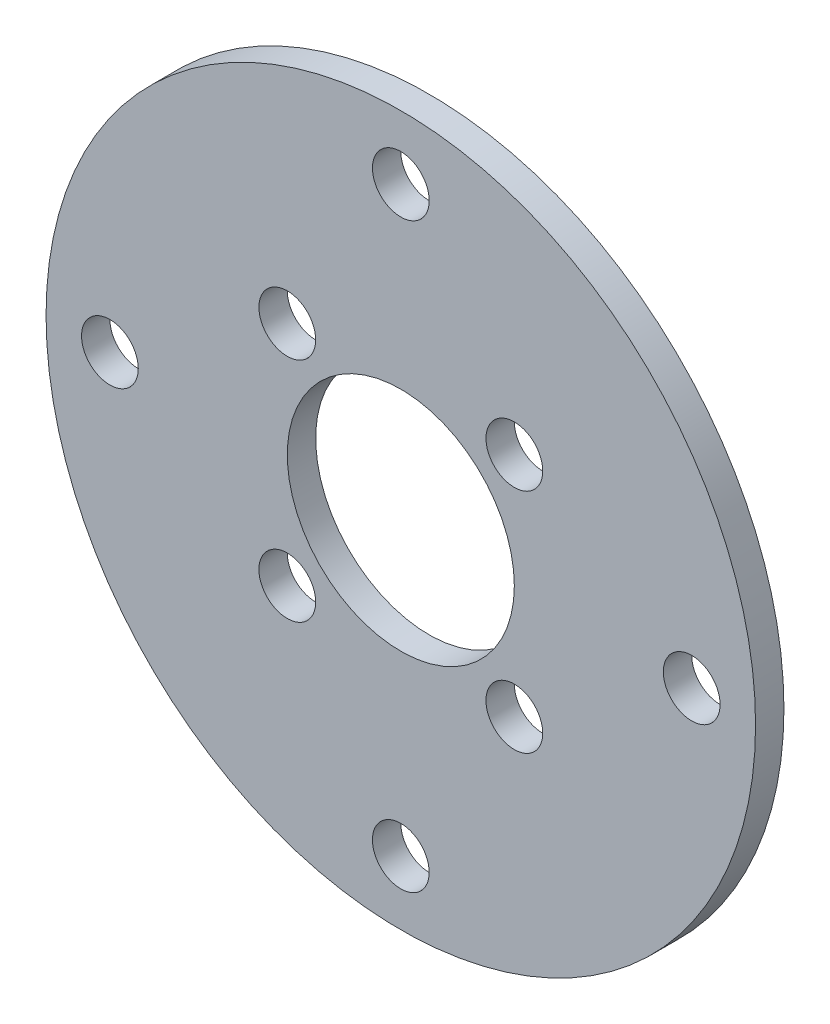
ISO-10303-21;
HEADER;
FILE_DESCRIPTION(('STEP AP214'),'2;1');
FILE_NAME('part.step','',(''),(''),'','','');
FILE_SCHEMA(('AUTOMOTIVE_DESIGN { 1 0 10303 214 1 1 1 1 }'));
ENDSEC;
DATA;
#1=APPLICATION_CONTEXT('core data for automotive mechanical design processes');
#2=APPLICATION_PROTOCOL_DEFINITION('international standard','automotive_design',2000,#1);
#3=PRODUCT_CONTEXT('',#1,'mechanical');
#4=PRODUCT('Part','Part','',(#3));
#5=PRODUCT_RELATED_PRODUCT_CATEGORY('part','',(#4));
#6=PRODUCT_DEFINITION_FORMATION('','',#4);
#7=PRODUCT_DEFINITION_CONTEXT('part definition',#1,'design');
#8=PRODUCT_DEFINITION('design','',#6,#7);
#9=PRODUCT_DEFINITION_SHAPE('','',#8);
#10=(LENGTH_UNIT() NAMED_UNIT(*) SI_UNIT(.MILLI.,.METRE.));
#11=(NAMED_UNIT(*) PLANE_ANGLE_UNIT() SI_UNIT($,.RADIAN.));
#12=(NAMED_UNIT(*) SI_UNIT($,.STERADIAN.) SOLID_ANGLE_UNIT());
#13=UNCERTAINTY_MEASURE_WITH_UNIT(LENGTH_MEASURE(1.E-05),#10,'distance_accuracy_value','');
#14=(GEOMETRIC_REPRESENTATION_CONTEXT(3) GLOBAL_UNCERTAINTY_ASSIGNED_CONTEXT((#13)) GLOBAL_UNIT_ASSIGNED_CONTEXT((#10,
#11,#12)) REPRESENTATION_CONTEXT('',''));
#15=CARTESIAN_POINT('',(0.,0.,0.));
#16=DIRECTION('',(0.,0.,1.));
#17=DIRECTION('',(1.,0.,0.));
#18=AXIS2_PLACEMENT_3D('',#15,#16,#17);
#19=CARTESIAN_POINT('',(0.,0.,2.));
#20=DIRECTION('',(0.,0.,1.));
#21=DIRECTION('',(1.,0.,0.));
#22=AXIS2_PLACEMENT_3D('',#19,#20,#21);
#23=PLANE('',#22);
#24=CARTESIAN_POINT('',(1.15775850883181E-12,-20.5,2.));
#25=DIRECTION('',(0.,0.,1.));
#26=DIRECTION('',(1.,0.,0.));
#27=AXIS2_PLACEMENT_3D('',#24,#25,#26);
#28=CIRCLE('',#27,2.00000000000124);
#29=CARTESIAN_POINT('',(2.0000000000024,-20.5,2.));
#30=VERTEX_POINT('',#29);
#31=EDGE_CURVE('E85',#30,#30,#28,.T.);
#32=ORIENTED_EDGE('',*,*,#31,.F.);
#33=EDGE_LOOP('',(#32));
#34=FACE_BOUND('',#33,.T.);
#35=CARTESIAN_POINT('',(0.,20.5,2.));
#36=DIRECTION('',(0.,0.,1.));
#37=DIRECTION('',(1.,0.,0.));
#38=AXIS2_PLACEMENT_3D('',#35,#36,#37);
#39=CIRCLE('',#38,2.);
#40=CARTESIAN_POINT('',(2.,20.5,2.));
#41=VERTEX_POINT('',#40);
#42=EDGE_CURVE('E73',#41,#41,#39,.T.);
#43=ORIENTED_EDGE('',*,*,#42,.F.);
#44=EDGE_LOOP('',(#43));
#45=FACE_BOUND('',#44,.T.);
#46=CARTESIAN_POINT('',(8.,-8.,2.));
#47=DIRECTION('',(0.,0.,1.));
#48=DIRECTION('',(-1.,0.,0.));
#49=AXIS2_PLACEMENT_3D('',#46,#47,#48);
#50=CIRCLE('',#49,2.);
#51=CARTESIAN_POINT('',(6.,-8.,2.));
#52=VERTEX_POINT('',#51);
#53=EDGE_CURVE('E61',#52,#52,#50,.T.);
#54=ORIENTED_EDGE('',*,*,#53,.F.);
#55=EDGE_LOOP('',(#54));
#56=FACE_BOUND('',#55,.T.);
#57=CARTESIAN_POINT('',(-8.,8.,2.));
#58=DIRECTION('',(0.,0.,1.));
#59=DIRECTION('',(1.,0.,0.));
#60=AXIS2_PLACEMENT_3D('',#57,#58,#59);
#61=CIRCLE('',#60,2.);
#62=CARTESIAN_POINT('',(-6.,8.,2.));
#63=VERTEX_POINT('',#62);
#64=EDGE_CURVE('E49',#63,#63,#61,.T.);
#65=ORIENTED_EDGE('',*,*,#64,.F.);
#66=EDGE_LOOP('',(#65));
#67=FACE_BOUND('',#66,.T.);
#68=CARTESIAN_POINT('',(0.,0.,2.));
#69=DIRECTION('',(0.,0.,1.));
#70=DIRECTION('',(1.,0.,0.));
#71=AXIS2_PLACEMENT_3D('',#68,#69,#70);
#72=CIRCLE('',#71,25.);
#73=CARTESIAN_POINT('',(25.,0.,2.));
#74=VERTEX_POINT('',#73);
#75=EDGE_CURVE('E10',#74,#74,#72,.T.);
#76=ORIENTED_EDGE('',*,*,#75,.T.);
#77=EDGE_LOOP('',(#76));
#78=FACE_BOUND('',#77,.T.);
#79=CARTESIAN_POINT('',(0.,0.,2.));
#80=DIRECTION('',(0.,0.,1.));
#81=DIRECTION('',(1.,0.,0.));
#82=AXIS2_PLACEMENT_3D('',#79,#80,#81);
#83=CIRCLE('',#82,8.);
#84=CARTESIAN_POINT('',(8.,0.,2.));
#85=VERTEX_POINT('',#84);
#86=EDGE_CURVE('E44',#85,#85,#83,.T.);
#87=ORIENTED_EDGE('',*,*,#86,.F.);
#88=EDGE_LOOP('',(#87));
#89=FACE_BOUND('',#88,.T.);
#90=CARTESIAN_POINT('',(8.,8.,2.));
#91=DIRECTION('',(0.,0.,1.));
#92=DIRECTION('',(1.,0.,0.));
#93=AXIS2_PLACEMENT_3D('',#90,#91,#92);
#94=CIRCLE('',#93,2.);
#95=CARTESIAN_POINT('',(10.,8.,2.));
#96=VERTEX_POINT('',#95);
#97=EDGE_CURVE('E55',#96,#96,#94,.T.);
#98=ORIENTED_EDGE('',*,*,#97,.F.);
#99=EDGE_LOOP('',(#98));
#100=FACE_BOUND('',#99,.T.);
#101=CARTESIAN_POINT('',(-8.,-8.,2.));
#102=DIRECTION('',(0.,0.,1.));
#103=DIRECTION('',(-1.,0.,0.));
#104=AXIS2_PLACEMENT_3D('',#101,#102,#103);
#105=CIRCLE('',#104,2.);
#106=CARTESIAN_POINT('',(-10.,-8.,2.));
#107=VERTEX_POINT('',#106);
#108=EDGE_CURVE('E67',#107,#107,#105,.T.);
#109=ORIENTED_EDGE('',*,*,#108,.F.);
#110=EDGE_LOOP('',(#109));
#111=FACE_BOUND('',#110,.T.);
#112=CARTESIAN_POINT('',(20.5000000000006,5.78879254415904E-13,2.));
#113=DIRECTION('',(0.,0.,1.));
#114=DIRECTION('',(1.,0.,0.));
#115=AXIS2_PLACEMENT_3D('',#112,#113,#114);
#116=CIRCLE('',#115,2.00000000000045);
#117=CARTESIAN_POINT('',(22.500000000001,5.78879254415904E-13,2.));
#118=VERTEX_POINT('',#117);
#119=EDGE_CURVE('E79',#118,#118,#116,.T.);
#120=ORIENTED_EDGE('',*,*,#119,.F.);
#121=EDGE_LOOP('',(#120));
#122=FACE_BOUND('',#121,.T.);
#123=CARTESIAN_POINT('',(-20.4999999999994,-5.81389780354156E-13,2.));
#124=DIRECTION('',(0.,0.,1.));
#125=DIRECTION('',(1.,0.,0.));
#126=AXIS2_PLACEMENT_3D('',#123,#124,#125);
#127=CIRCLE('',#126,2.00000000000093);
#128=CARTESIAN_POINT('',(-18.4999999999985,-5.81389780354156E-13,2.));
#129=VERTEX_POINT('',#128);
#130=EDGE_CURVE('E91',#129,#129,#127,.T.);
#131=ORIENTED_EDGE('',*,*,#130,.F.);
#132=EDGE_LOOP('',(#131));
#133=FACE_BOUND('',#132,.T.);
#134=ADVANCED_FACE('F33',(#34,#45,#56,#67,#78,#89,#100,#111,#122,#133),#23,.T.);
#135=CARTESIAN_POINT('',(0.,0.,0.));
#136=DIRECTION('',(0.,0.,1.));
#137=DIRECTION('',(1.,0.,0.));
#138=AXIS2_PLACEMENT_3D('',#135,#136,#137);
#139=PLANE('',#138);
#140=CARTESIAN_POINT('',(0.,0.,0.));
#141=DIRECTION('',(0.,0.,1.));
#142=DIRECTION('',(1.,0.,0.));
#143=AXIS2_PLACEMENT_3D('',#140,#141,#142);
#144=CIRCLE('',#143,25.);
#145=CARTESIAN_POINT('',(25.,0.,0.));
#146=VERTEX_POINT('',#145);
#147=EDGE_CURVE('E37',#146,#146,#144,.T.);
#148=ORIENTED_EDGE('',*,*,#147,.F.);
#149=EDGE_LOOP('',(#148));
#150=FACE_BOUND('',#149,.T.);
#151=CARTESIAN_POINT('',(0.,0.,0.));
#152=DIRECTION('',(0.,0.,1.));
#153=DIRECTION('',(1.,0.,0.));
#154=AXIS2_PLACEMENT_3D('',#151,#152,#153);
#155=CIRCLE('',#154,8.);
#156=CARTESIAN_POINT('',(8.,0.,0.));
#157=VERTEX_POINT('',#156);
#158=EDGE_CURVE('E46',#157,#157,#155,.T.);
#159=ORIENTED_EDGE('',*,*,#158,.T.);
#160=EDGE_LOOP('',(#159));
#161=FACE_BOUND('',#160,.T.);
#162=CARTESIAN_POINT('',(-8.,8.,0.));
#163=DIRECTION('',(0.,0.,1.));
#164=DIRECTION('',(1.,0.,0.));
#165=AXIS2_PLACEMENT_3D('',#162,#163,#164);
#166=CIRCLE('',#165,2.);
#167=CARTESIAN_POINT('',(-6.,8.,0.));
#168=VERTEX_POINT('',#167);
#169=EDGE_CURVE('E52',#168,#168,#166,.T.);
#170=ORIENTED_EDGE('',*,*,#169,.T.);
#171=EDGE_LOOP('',(#170));
#172=FACE_BOUND('',#171,.T.);
#173=CARTESIAN_POINT('',(8.,8.,0.));
#174=DIRECTION('',(0.,0.,1.));
#175=DIRECTION('',(1.,0.,0.));
#176=AXIS2_PLACEMENT_3D('',#173,#174,#175);
#177=CIRCLE('',#176,2.);
#178=CARTESIAN_POINT('',(10.,8.,0.));
#179=VERTEX_POINT('',#178);
#180=EDGE_CURVE('E58',#179,#179,#177,.T.);
#181=ORIENTED_EDGE('',*,*,#180,.T.);
#182=EDGE_LOOP('',(#181));
#183=FACE_BOUND('',#182,.T.);
#184=CARTESIAN_POINT('',(8.,-8.,0.));
#185=DIRECTION('',(0.,0.,1.));
#186=DIRECTION('',(-1.,0.,0.));
#187=AXIS2_PLACEMENT_3D('',#184,#185,#186);
#188=CIRCLE('',#187,2.);
#189=CARTESIAN_POINT('',(6.,-8.,0.));
#190=VERTEX_POINT('',#189);
#191=EDGE_CURVE('E64',#190,#190,#188,.T.);
#192=ORIENTED_EDGE('',*,*,#191,.T.);
#193=EDGE_LOOP('',(#192));
#194=FACE_BOUND('',#193,.T.);
#195=CARTESIAN_POINT('',(-8.,-8.,0.));
#196=DIRECTION('',(0.,0.,1.));
#197=DIRECTION('',(-1.,0.,0.));
#198=AXIS2_PLACEMENT_3D('',#195,#196,#197);
#199=CIRCLE('',#198,2.);
#200=CARTESIAN_POINT('',(-10.,-8.,0.));
#201=VERTEX_POINT('',#200);
#202=EDGE_CURVE('E70',#201,#201,#199,.T.);
#203=ORIENTED_EDGE('',*,*,#202,.T.);
#204=EDGE_LOOP('',(#203));
#205=FACE_BOUND('',#204,.T.);
#206=CARTESIAN_POINT('',(0.,20.5,0.));
#207=DIRECTION('',(0.,0.,1.));
#208=DIRECTION('',(1.,0.,0.));
#209=AXIS2_PLACEMENT_3D('',#206,#207,#208);
#210=CIRCLE('',#209,2.);
#211=CARTESIAN_POINT('',(2.,20.5,0.));
#212=VERTEX_POINT('',#211);
#213=EDGE_CURVE('E76',#212,#212,#210,.T.);
#214=ORIENTED_EDGE('',*,*,#213,.T.);
#215=EDGE_LOOP('',(#214));
#216=FACE_BOUND('',#215,.T.);
#217=CARTESIAN_POINT('',(20.5000000000006,5.78879254415904E-13,0.));
#218=DIRECTION('',(0.,0.,1.));
#219=DIRECTION('',(1.,0.,0.));
#220=AXIS2_PLACEMENT_3D('',#217,#218,#219);
#221=CIRCLE('',#220,2.00000000000045);
#222=CARTESIAN_POINT('',(22.500000000001,5.78879254415904E-13,0.));
#223=VERTEX_POINT('',#222);
#224=EDGE_CURVE('E82',#223,#223,#221,.T.);
#225=ORIENTED_EDGE('',*,*,#224,.T.);
#226=EDGE_LOOP('',(#225));
#227=FACE_BOUND('',#226,.T.);
#228=CARTESIAN_POINT('',(1.15775850883181E-12,-20.5,0.));
#229=DIRECTION('',(0.,0.,1.));
#230=DIRECTION('',(1.,0.,0.));
#231=AXIS2_PLACEMENT_3D('',#228,#229,#230);
#232=CIRCLE('',#231,2.00000000000124);
#233=CARTESIAN_POINT('',(2.0000000000024,-20.5,0.));
#234=VERTEX_POINT('',#233);
#235=EDGE_CURVE('E88',#234,#234,#232,.T.);
#236=ORIENTED_EDGE('',*,*,#235,.T.);
#237=EDGE_LOOP('',(#236));
#238=FACE_BOUND('',#237,.T.);
#239=CARTESIAN_POINT('',(-20.4999999999994,-5.81389780354156E-13,0.));
#240=DIRECTION('',(0.,0.,1.));
#241=DIRECTION('',(1.,0.,0.));
#242=AXIS2_PLACEMENT_3D('',#239,#240,#241);
#243=CIRCLE('',#242,2.00000000000093);
#244=CARTESIAN_POINT('',(-18.4999999999985,-5.81389780354156E-13,0.));
#245=VERTEX_POINT('',#244);
#246=EDGE_CURVE('E94',#245,#245,#243,.T.);
#247=ORIENTED_EDGE('',*,*,#246,.T.);
#248=EDGE_LOOP('',(#247));
#249=FACE_BOUND('',#248,.T.);
#250=ADVANCED_FACE('F104',(#150,#161,#172,#183,#194,#205,#216,#227,#238,#249),#139,.F.);
#251=CARTESIAN_POINT('',(0.,0.,2.));
#252=DIRECTION('',(0.,0.,-1.));
#253=DIRECTION('',(-1.,0.,0.));
#254=AXIS2_PLACEMENT_3D('',#251,#252,#253);
#255=CYLINDRICAL_SURFACE('',#254,25.);
#256=ORIENTED_EDGE('',*,*,#75,.F.);
#257=EDGE_LOOP('',(#256));
#258=FACE_BOUND('',#257,.T.);
#259=ORIENTED_EDGE('',*,*,#147,.T.);
#260=EDGE_LOOP('',(#259));
#261=FACE_BOUND('',#260,.T.);
#262=ADVANCED_FACE('F35',(#258,#261),#255,.T.);
#263=CARTESIAN_POINT('',(0.,0.,2.));
#264=DIRECTION('',(0.,0.,-1.));
#265=DIRECTION('',(-1.,0.,0.));
#266=AXIS2_PLACEMENT_3D('',#263,#264,#265);
#267=CYLINDRICAL_SURFACE('',#266,8.);
#268=ORIENTED_EDGE('',*,*,#86,.T.);
#269=EDGE_LOOP('',(#268));
#270=FACE_BOUND('',#269,.T.);
#271=ORIENTED_EDGE('',*,*,#158,.F.);
#272=EDGE_LOOP('',(#271));
#273=FACE_BOUND('',#272,.T.);
#274=ADVANCED_FACE('F114',(#270,#273),#267,.F.);
#275=CARTESIAN_POINT('',(-8.,8.,2.));
#276=DIRECTION('',(0.,0.,-1.));
#277=DIRECTION('',(-1.,0.,0.));
#278=AXIS2_PLACEMENT_3D('',#275,#276,#277);
#279=CYLINDRICAL_SURFACE('',#278,2.);
#280=ORIENTED_EDGE('',*,*,#64,.T.);
#281=EDGE_LOOP('',(#280));
#282=FACE_BOUND('',#281,.T.);
#283=ORIENTED_EDGE('',*,*,#169,.F.);
#284=EDGE_LOOP('',(#283));
#285=FACE_BOUND('',#284,.T.);
#286=ADVANCED_FACE('F117',(#282,#285),#279,.F.);
#287=CARTESIAN_POINT('',(8.,8.,2.));
#288=DIRECTION('',(0.,0.,-1.));
#289=DIRECTION('',(-1.,0.,0.));
#290=AXIS2_PLACEMENT_3D('',#287,#288,#289);
#291=CYLINDRICAL_SURFACE('',#290,2.);
#292=ORIENTED_EDGE('',*,*,#97,.T.);
#293=EDGE_LOOP('',(#292));
#294=FACE_BOUND('',#293,.T.);
#295=ORIENTED_EDGE('',*,*,#180,.F.);
#296=EDGE_LOOP('',(#295));
#297=FACE_BOUND('',#296,.T.);
#298=ADVANCED_FACE('F121',(#294,#297),#291,.F.);
#299=CARTESIAN_POINT('',(8.,-8.,2.));
#300=DIRECTION('',(0.,0.,-1.));
#301=DIRECTION('',(-1.,0.,0.));
#302=AXIS2_PLACEMENT_3D('',#299,#300,#301);
#303=CYLINDRICAL_SURFACE('',#302,2.);
#304=ORIENTED_EDGE('',*,*,#53,.T.);
#305=EDGE_LOOP('',(#304));
#306=FACE_BOUND('',#305,.T.);
#307=ORIENTED_EDGE('',*,*,#191,.F.);
#308=EDGE_LOOP('',(#307));
#309=FACE_BOUND('',#308,.T.);
#310=ADVANCED_FACE('F125',(#306,#309),#303,.F.);
#311=CARTESIAN_POINT('',(-8.,-8.,2.));
#312=DIRECTION('',(0.,0.,-1.));
#313=DIRECTION('',(-1.,0.,0.));
#314=AXIS2_PLACEMENT_3D('',#311,#312,#313);
#315=CYLINDRICAL_SURFACE('',#314,2.);
#316=ORIENTED_EDGE('',*,*,#108,.T.);
#317=EDGE_LOOP('',(#316));
#318=FACE_BOUND('',#317,.T.);
#319=ORIENTED_EDGE('',*,*,#202,.F.);
#320=EDGE_LOOP('',(#319));
#321=FACE_BOUND('',#320,.T.);
#322=ADVANCED_FACE('F129',(#318,#321),#315,.F.);
#323=CARTESIAN_POINT('',(0.,20.5,2.));
#324=DIRECTION('',(0.,0.,-1.));
#325=DIRECTION('',(-1.,0.,0.));
#326=AXIS2_PLACEMENT_3D('',#323,#324,#325);
#327=CYLINDRICAL_SURFACE('',#326,2.);
#328=ORIENTED_EDGE('',*,*,#42,.T.);
#329=EDGE_LOOP('',(#328));
#330=FACE_BOUND('',#329,.T.);
#331=ORIENTED_EDGE('',*,*,#213,.F.);
#332=EDGE_LOOP('',(#331));
#333=FACE_BOUND('',#332,.T.);
#334=ADVANCED_FACE('F133',(#330,#333),#327,.F.);
#335=CARTESIAN_POINT('',(20.5000000000006,5.78879254415904E-13,2.));
#336=DIRECTION('',(0.,0.,-1.));
#337=DIRECTION('',(-1.,0.,0.));
#338=AXIS2_PLACEMENT_3D('',#335,#336,#337);
#339=CYLINDRICAL_SURFACE('',#338,2.00000000000045);
#340=ORIENTED_EDGE('',*,*,#119,.T.);
#341=EDGE_LOOP('',(#340));
#342=FACE_BOUND('',#341,.T.);
#343=ORIENTED_EDGE('',*,*,#224,.F.);
#344=EDGE_LOOP('',(#343));
#345=FACE_BOUND('',#344,.T.);
#346=ADVANCED_FACE('F137',(#342,#345),#339,.F.);
#347=CARTESIAN_POINT('',(1.15775850883181E-12,-20.5,2.));
#348=DIRECTION('',(0.,0.,-1.));
#349=DIRECTION('',(-1.,0.,0.));
#350=AXIS2_PLACEMENT_3D('',#347,#348,#349);
#351=CYLINDRICAL_SURFACE('',#350,2.00000000000124);
#352=ORIENTED_EDGE('',*,*,#31,.T.);
#353=EDGE_LOOP('',(#352));
#354=FACE_BOUND('',#353,.T.);
#355=ORIENTED_EDGE('',*,*,#235,.F.);
#356=EDGE_LOOP('',(#355));
#357=FACE_BOUND('',#356,.T.);
#358=ADVANCED_FACE('F141',(#354,#357),#351,.F.);
#359=CARTESIAN_POINT('',(-20.4999999999994,-5.81389780354156E-13,2.));
#360=DIRECTION('',(0.,0.,-1.));
#361=DIRECTION('',(-1.,0.,0.));
#362=AXIS2_PLACEMENT_3D('',#359,#360,#361);
#363=CYLINDRICAL_SURFACE('',#362,2.00000000000093);
#364=ORIENTED_EDGE('',*,*,#130,.T.);
#365=EDGE_LOOP('',(#364));
#366=FACE_BOUND('',#365,.T.);
#367=ORIENTED_EDGE('',*,*,#246,.F.);
#368=EDGE_LOOP('',(#367));
#369=FACE_BOUND('',#368,.T.);
#370=ADVANCED_FACE('F100',(#366,#369),#363,.F.);
#371=CLOSED_SHELL('',(#134,#250,#262,#274,#286,#298,#310,#322,#334,#346,#358,#370));
#372=MANIFOLD_SOLID_BREP('B2',#371);
#373=ADVANCED_BREP_SHAPE_REPRESENTATION('',(#18,#372),#14);
#374=SHAPE_DEFINITION_REPRESENTATION(#9,#373);
ENDSEC;
END-ISO-10303-21;
